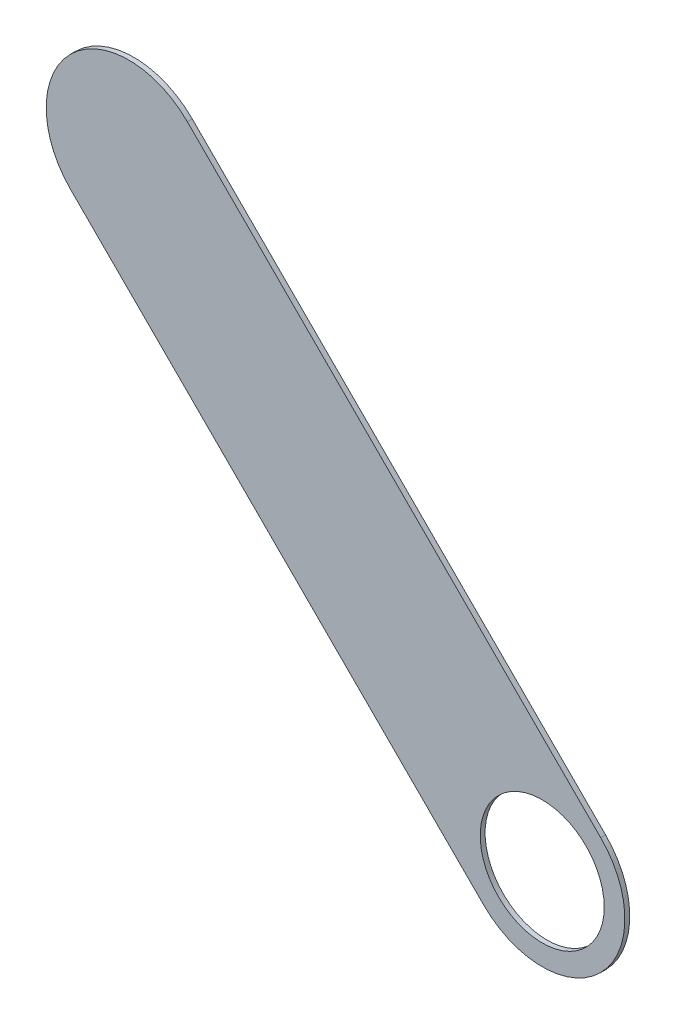
ISO-10303-21;
HEADER;
FILE_DESCRIPTION(('STEP AP214'),'2;1');
FILE_NAME('part.step','',(''),(''),'','','');
FILE_SCHEMA(('AUTOMOTIVE_DESIGN { 1 0 10303 214 1 1 1 1 }'));
ENDSEC;
DATA;
#1=APPLICATION_CONTEXT('core data for automotive mechanical design processes');
#2=APPLICATION_PROTOCOL_DEFINITION('international standard','automotive_design',2000,#1);
#3=PRODUCT_CONTEXT('',#1,'mechanical');
#4=PRODUCT('Part','Part','',(#3));
#5=PRODUCT_RELATED_PRODUCT_CATEGORY('part','',(#4));
#6=PRODUCT_DEFINITION_FORMATION('','',#4);
#7=PRODUCT_DEFINITION_CONTEXT('part definition',#1,'design');
#8=PRODUCT_DEFINITION('design','',#6,#7);
#9=PRODUCT_DEFINITION_SHAPE('','',#8);
#10=(LENGTH_UNIT() NAMED_UNIT(*) SI_UNIT(.MILLI.,.METRE.));
#11=(NAMED_UNIT(*) PLANE_ANGLE_UNIT() SI_UNIT($,.RADIAN.));
#12=(NAMED_UNIT(*) SI_UNIT($,.STERADIAN.) SOLID_ANGLE_UNIT());
#13=UNCERTAINTY_MEASURE_WITH_UNIT(LENGTH_MEASURE(1.E-05),#10,'distance_accuracy_value','');
#14=(GEOMETRIC_REPRESENTATION_CONTEXT(3) GLOBAL_UNCERTAINTY_ASSIGNED_CONTEXT((#13)) GLOBAL_UNIT_ASSIGNED_CONTEXT((#10,
#11,#12)) REPRESENTATION_CONTEXT('',''));
#15=CARTESIAN_POINT('',(0.,0.,0.));
#16=DIRECTION('',(0.,0.,1.));
#17=DIRECTION('',(1.,0.,0.));
#18=AXIS2_PLACEMENT_3D('',#15,#16,#17);
#19=CARTESIAN_POINT('',(32.47574658,58.53574018,0.));
#20=DIRECTION('',(0.707106781186548,0.707106781186547,0.));
#21=DIRECTION('',(0.707106781186547,-0.707106781186548,0.));
#22=AXIS2_PLACEMENT_3D('',#19,#20,#21);
#23=PLANE('',#22);
#24=DIRECTION('',(0.707106781186547,-0.707106781186548,0.));
#25=VECTOR('',#24,1.);
#26=CARTESIAN_POINT('',(32.47574658,58.53574018,0.03556));
#27=LINE('',#26,#25);
#28=CARTESIAN_POINT('',(32.47574658,58.53574018,0.03556));
#29=VERTEX_POINT('',#28);
#30=CARTESIAN_POINT('',(35.47574058,55.53574618,0.03556));
#31=VERTEX_POINT('',#30);
#32=EDGE_CURVE('E11',#29,#31,#27,.T.);
#33=ORIENTED_EDGE('',*,*,#32,.F.);
#34=DIRECTION('',(0.,0.,1.));
#35=VECTOR('',#34,1.);
#36=CARTESIAN_POINT('',(32.47574658,58.53574018,0.));
#37=LINE('',#36,#35);
#38=CARTESIAN_POINT('',(32.47574658,58.53574018,0.));
#39=VERTEX_POINT('',#38);
#40=EDGE_CURVE('E24',#39,#29,#37,.T.);
#41=ORIENTED_EDGE('',*,*,#40,.F.);
#42=DIRECTION('',(0.707106781186547,-0.707106781186548,0.));
#43=VECTOR('',#42,1.);
#44=CARTESIAN_POINT('',(32.47574658,58.53574018,0.));
#45=LINE('',#44,#43);
#46=CARTESIAN_POINT('',(35.47574058,55.53574618,0.));
#47=VERTEX_POINT('',#46);
#48=EDGE_CURVE('E96',#39,#47,#45,.T.);
#49=ORIENTED_EDGE('',*,*,#48,.T.);
#50=DIRECTION('',(0.,0.,1.));
#51=VECTOR('',#50,1.);
#52=CARTESIAN_POINT('',(35.47574058,55.53574618,0.));
#53=LINE('',#52,#51);
#54=EDGE_CURVE('E37',#47,#31,#53,.T.);
#55=ORIENTED_EDGE('',*,*,#54,.T.);
#56=EDGE_LOOP('',(#33,#41,#49,#55));
#57=FACE_BOUND('',#56,.T.);
#58=ADVANCED_FACE('F17',(#57),#23,.F.);
#59=CARTESIAN_POINT('',(32.9000104,58.960004,0.));
#60=DIRECTION('',(0.,0.,-1.));
#61=DIRECTION('',(0.707106781186548,0.707106781186548,0.));
#62=AXIS2_PLACEMENT_3D('',#59,#60,#61);
#63=CYLINDRICAL_SURFACE('',#62,0.599999648268218);
#64=CARTESIAN_POINT('',(32.9000104,58.960004,0.03556));
#65=DIRECTION('',(0.,0.,1.));
#66=DIRECTION('',(0.707106781186548,0.707106781186548,0.));
#67=AXIS2_PLACEMENT_3D('',#64,#65,#66);
#68=CIRCLE('',#67,0.599999648268218);
#69=CARTESIAN_POINT('',(33.32427422,59.38426782,0.03556));
#70=VERTEX_POINT('',#69);
#71=EDGE_CURVE('E92',#70,#29,#68,.T.);
#72=ORIENTED_EDGE('',*,*,#71,.F.);
#73=DIRECTION('',(0.,0.,1.));
#74=VECTOR('',#73,1.);
#75=CARTESIAN_POINT('',(33.32427422,59.38426782,0.));
#76=LINE('',#75,#74);
#77=CARTESIAN_POINT('',(33.32427422,59.38426782,0.));
#78=VERTEX_POINT('',#77);
#79=EDGE_CURVE('E90',#78,#70,#76,.T.);
#80=ORIENTED_EDGE('',*,*,#79,.F.);
#81=CARTESIAN_POINT('',(32.9000104,58.960004,0.));
#82=DIRECTION('',(0.,0.,1.));
#83=DIRECTION('',(0.707106781186548,0.707106781186548,0.));
#84=AXIS2_PLACEMENT_3D('',#81,#82,#83);
#85=CIRCLE('',#84,0.599999648268218);
#86=EDGE_CURVE('E88',#78,#39,#85,.T.);
#87=ORIENTED_EDGE('',*,*,#86,.T.);
#88=ORIENTED_EDGE('',*,*,#40,.T.);
#89=EDGE_LOOP('',(#72,#80,#87,#88));
#90=FACE_BOUND('',#89,.T.);
#91=ADVANCED_FACE('F111',(#90),#63,.T.);
#92=CARTESIAN_POINT('',(35.9000044,55.96001,0.));
#93=DIRECTION('',(0.,0.,-1.));
#94=DIRECTION('',(-0.707106781186542,-0.707106781186554,0.));
#95=AXIS2_PLACEMENT_3D('',#92,#93,#94);
#96=CYLINDRICAL_SURFACE('',#95,0.599999648268223);
#97=CARTESIAN_POINT('',(35.9000044,55.96001,0.03556));
#98=DIRECTION('',(0.,0.,1.));
#99=DIRECTION('',(-0.707106781186542,-0.707106781186554,0.));
#100=AXIS2_PLACEMENT_3D('',#97,#98,#99);
#101=CIRCLE('',#100,0.599999648268223);
#102=CARTESIAN_POINT('',(36.32426822,56.38427382,0.03556));
#103=VERTEX_POINT('',#102);
#104=EDGE_CURVE('E85',#31,#103,#101,.T.);
#105=ORIENTED_EDGE('',*,*,#104,.F.);
#106=ORIENTED_EDGE('',*,*,#54,.F.);
#107=CARTESIAN_POINT('',(35.9000044,55.96001,0.));
#108=DIRECTION('',(0.,0.,1.));
#109=DIRECTION('',(-0.707106781186542,-0.707106781186554,0.));
#110=AXIS2_PLACEMENT_3D('',#107,#108,#109);
#111=CIRCLE('',#110,0.599999648268223);
#112=CARTESIAN_POINT('',(36.32426822,56.38427382,0.));
#113=VERTEX_POINT('',#112);
#114=EDGE_CURVE('E82',#47,#113,#111,.T.);
#115=ORIENTED_EDGE('',*,*,#114,.T.);
#116=DIRECTION('',(0.,0.,1.));
#117=VECTOR('',#116,1.);
#118=CARTESIAN_POINT('',(36.32426822,56.38427382,0.));
#119=LINE('',#118,#117);
#120=EDGE_CURVE('E80',#113,#103,#119,.T.);
#121=ORIENTED_EDGE('',*,*,#120,.T.);
#122=EDGE_LOOP('',(#105,#106,#115,#121));
#123=FACE_BOUND('',#122,.T.);
#124=ADVANCED_FACE('F104',(#123),#96,.T.);
#125=CARTESIAN_POINT('',(36.32426822,56.38427382,0.));
#126=DIRECTION('',(-0.707106781186547,-0.707106781186549,0.));
#127=DIRECTION('',(-0.707106781186549,0.707106781186547,0.));
#128=AXIS2_PLACEMENT_3D('',#125,#126,#127);
#129=PLANE('',#128);
#130=DIRECTION('',(-0.707106781186549,0.707106781186547,0.));
#131=VECTOR('',#130,1.);
#132=CARTESIAN_POINT('',(36.32426822,56.38427382,0.03556));
#133=LINE('',#132,#131);
#134=EDGE_CURVE('E77',#103,#70,#133,.T.);
#135=ORIENTED_EDGE('',*,*,#134,.F.);
#136=ORIENTED_EDGE('',*,*,#120,.F.);
#137=DIRECTION('',(-0.707106781186549,0.707106781186547,0.));
#138=VECTOR('',#137,1.);
#139=CARTESIAN_POINT('',(36.32426822,56.38427382,0.));
#140=LINE('',#139,#138);
#141=EDGE_CURVE('E68',#113,#78,#140,.T.);
#142=ORIENTED_EDGE('',*,*,#141,.T.);
#143=ORIENTED_EDGE('',*,*,#79,.T.);
#144=EDGE_LOOP('',(#135,#136,#142,#143));
#145=FACE_BOUND('',#144,.T.);
#146=ADVANCED_FACE('F110',(#145),#129,.F.);
#147=CARTESIAN_POINT('',(35.9000044,55.96001,0.));
#148=DIRECTION('',(0.,0.,-1.));
#149=DIRECTION('',(1.,0.,0.));
#150=AXIS2_PLACEMENT_3D('',#147,#148,#149);
#151=CYLINDRICAL_SURFACE('',#150,0.4499991);
#152=DIRECTION('',(0.,0.,1.));
#153=VECTOR('',#152,1.);
#154=CARTESIAN_POINT('',(36.3500035,55.96001,0.));
#155=LINE('',#154,#153);
#156=CARTESIAN_POINT('',(36.3500035,55.96001,0.));
#157=VERTEX_POINT('',#156);
#158=CARTESIAN_POINT('',(36.3500035,55.96001,0.03556));
#159=VERTEX_POINT('',#158);
#160=EDGE_CURVE('E62',#157,#159,#155,.T.);
#161=ORIENTED_EDGE('',*,*,#160,.T.);
#162=CARTESIAN_POINT('',(35.9000044,55.96001,0.03556));
#163=DIRECTION('',(0.,0.,1.));
#164=DIRECTION('',(1.,0.,0.));
#165=AXIS2_PLACEMENT_3D('',#162,#163,#164);
#166=CIRCLE('',#165,0.4499991);
#167=EDGE_CURVE('E67',#159,#159,#166,.T.);
#168=ORIENTED_EDGE('',*,*,#167,.T.);
#169=ORIENTED_EDGE('',*,*,#160,.F.);
#170=CARTESIAN_POINT('',(35.9000044,55.96001,0.));
#171=DIRECTION('',(0.,0.,1.));
#172=DIRECTION('',(1.,0.,0.));
#173=AXIS2_PLACEMENT_3D('',#170,#171,#172);
#174=CIRCLE('',#173,0.4499991);
#175=EDGE_CURVE('E65',#157,#157,#174,.T.);
#176=ORIENTED_EDGE('',*,*,#175,.F.);
#177=EDGE_LOOP('',(#161,#168,#169,#176));
#178=FACE_BOUND('',#177,.T.);
#179=ADVANCED_FACE('F64',(#178),#151,.F.);
#180=CARTESIAN_POINT('',(32.47574658,58.53574018,0.));
#181=DIRECTION('',(0.,0.,-1.));
#182=DIRECTION('',(-1.,0.,0.));
#183=AXIS2_PLACEMENT_3D('',#180,#181,#182);
#184=PLANE('',#183);
#185=ORIENTED_EDGE('',*,*,#48,.F.);
#186=ORIENTED_EDGE('',*,*,#86,.F.);
#187=ORIENTED_EDGE('',*,*,#141,.F.);
#188=ORIENTED_EDGE('',*,*,#114,.F.);
#189=EDGE_LOOP('',(#185,#186,#187,#188));
#190=FACE_BOUND('',#189,.T.);
#191=ORIENTED_EDGE('',*,*,#175,.T.);
#192=EDGE_LOOP('',(#191));
#193=FACE_BOUND('',#192,.T.);
#194=ADVANCED_FACE('F71',(#190,#193),#184,.T.);
#195=CARTESIAN_POINT('',(32.47574658,58.53574018,0.03556));
#196=DIRECTION('',(0.,0.,-1.));
#197=DIRECTION('',(-1.,0.,0.));
#198=AXIS2_PLACEMENT_3D('',#195,#196,#197);
#199=PLANE('',#198);
#200=ORIENTED_EDGE('',*,*,#134,.T.);
#201=ORIENTED_EDGE('',*,*,#71,.T.);
#202=ORIENTED_EDGE('',*,*,#32,.T.);
#203=ORIENTED_EDGE('',*,*,#104,.T.);
#204=EDGE_LOOP('',(#200,#201,#202,#203));
#205=FACE_BOUND('',#204,.T.);
#206=ORIENTED_EDGE('',*,*,#167,.F.);
#207=EDGE_LOOP('',(#206));
#208=FACE_BOUND('',#207,.T.);
#209=ADVANCED_FACE('F107',(#205,#208),#199,.F.);
#210=CLOSED_SHELL('',(#58,#91,#124,#146,#179,#194,#209));
#211=MANIFOLD_SOLID_BREP('B1',#210);
#212=ADVANCED_BREP_SHAPE_REPRESENTATION('',(#18,#211),#14);
#213=SHAPE_DEFINITION_REPRESENTATION(#9,#212);
ENDSEC;
END-ISO-10303-21;
